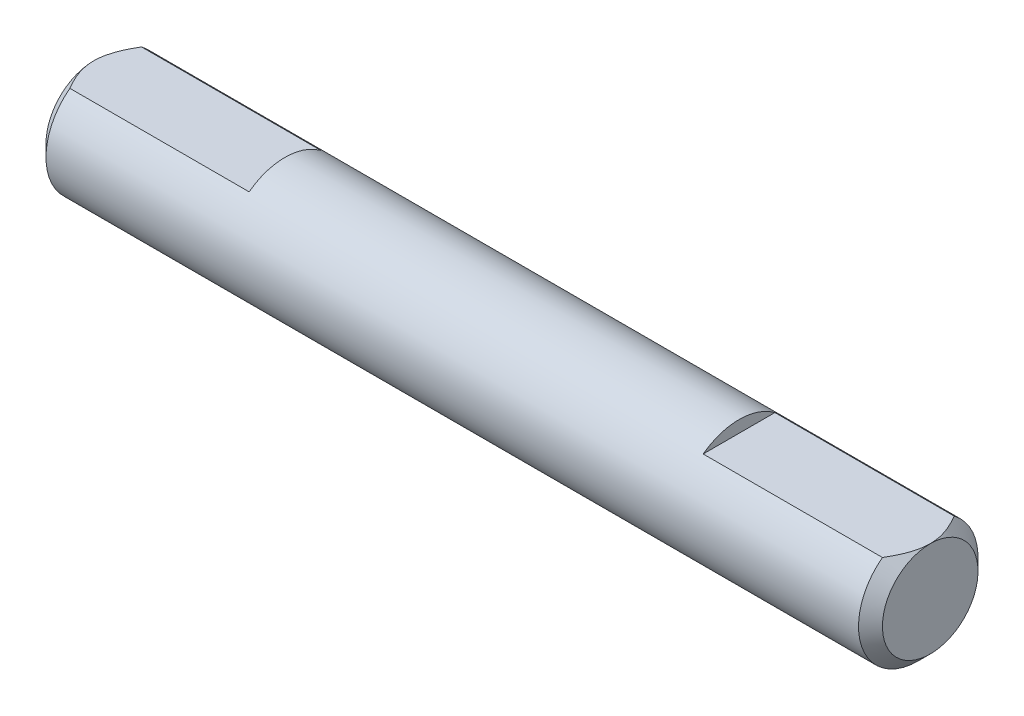
ISO-10303-21;
HEADER;
FILE_DESCRIPTION(('STEP AP214'),'2;1');
FILE_NAME('part.step','',(''),(''),'','','');
FILE_SCHEMA(('AUTOMOTIVE_DESIGN { 1 0 10303 214 1 1 1 1 }'));
ENDSEC;
DATA;
#1=APPLICATION_CONTEXT('core data for automotive mechanical design processes');
#2=APPLICATION_PROTOCOL_DEFINITION('international standard','automotive_design',2000,#1);
#3=PRODUCT_CONTEXT('',#1,'mechanical');
#4=PRODUCT('Part','Part','',(#3));
#5=PRODUCT_RELATED_PRODUCT_CATEGORY('part','',(#4));
#6=PRODUCT_DEFINITION_FORMATION('','',#4);
#7=PRODUCT_DEFINITION_CONTEXT('part definition',#1,'design');
#8=PRODUCT_DEFINITION('design','',#6,#7);
#9=PRODUCT_DEFINITION_SHAPE('','',#8);
#10=(LENGTH_UNIT() NAMED_UNIT(*) SI_UNIT(.MILLI.,.METRE.));
#11=(NAMED_UNIT(*) PLANE_ANGLE_UNIT() SI_UNIT($,.RADIAN.));
#12=(NAMED_UNIT(*) SI_UNIT($,.STERADIAN.) SOLID_ANGLE_UNIT());
#13=UNCERTAINTY_MEASURE_WITH_UNIT(LENGTH_MEASURE(1.E-05),#10,'distance_accuracy_value','');
#14=(GEOMETRIC_REPRESENTATION_CONTEXT(3) GLOBAL_UNCERTAINTY_ASSIGNED_CONTEXT((#13)) GLOBAL_UNIT_ASSIGNED_CONTEXT((#10,
#11,#12)) REPRESENTATION_CONTEXT('',''));
#15=CARTESIAN_POINT('',(0.,0.,0.));
#16=DIRECTION('',(0.,0.,1.));
#17=DIRECTION('',(1.,0.,0.));
#18=AXIS2_PLACEMENT_3D('',#15,#16,#17);
#19=CARTESIAN_POINT('',(17.5,0.,0.));
#20=DIRECTION('',(-1.,0.,0.));
#21=DIRECTION('',(0.,0.,1.));
#22=AXIS2_PLACEMENT_3D('',#19,#20,#21);
#23=CYLINDRICAL_SURFACE('',#22,2.5);
#24=DIRECTION('',(-1.,0.,0.));
#25=VECTOR('',#24,1.);
#26=CARTESIAN_POINT('',(17.5,2.,1.5));
#27=LINE('',#26,#25);
#28=CARTESIAN_POINT('',(-9.5,2.,1.5));
#29=VERTEX_POINT('',#28);
#30=CARTESIAN_POINT('',(-17.,2.,1.5));
#31=VERTEX_POINT('',#30);
#32=EDGE_CURVE('E80',#29,#31,#27,.T.);
#33=ORIENTED_EDGE('',*,*,#32,.T.);
#34=CARTESIAN_POINT('',(-17.,0.,0.));
#35=DIRECTION('',(1.,0.,0.));
#36=DIRECTION('',(0.,0.,-1.));
#37=AXIS2_PLACEMENT_3D('',#34,#35,#36);
#38=CIRCLE('',#37,2.5);
#39=CARTESIAN_POINT('',(-17.,2.,-1.5));
#40=VERTEX_POINT('',#39);
#41=EDGE_CURVE('E162',#31,#40,#38,.T.);
#42=ORIENTED_EDGE('',*,*,#41,.T.);
#43=DIRECTION('',(-1.,0.,0.));
#44=VECTOR('',#43,1.);
#45=CARTESIAN_POINT('',(17.5,2.,-1.5));
#46=LINE('',#45,#44);
#47=CARTESIAN_POINT('',(-9.5,2.,-1.5));
#48=VERTEX_POINT('',#47);
#49=EDGE_CURVE('E90',#40,#48,#46,.F.);
#50=ORIENTED_EDGE('',*,*,#49,.T.);
#51=CARTESIAN_POINT('',(-9.5,0.,0.));
#52=DIRECTION('',(-1.,0.,0.));
#53=DIRECTION('',(0.,0.,1.));
#54=AXIS2_PLACEMENT_3D('',#51,#52,#53);
#55=CIRCLE('',#54,2.5);
#56=EDGE_CURVE('E95',#29,#48,#55,.T.);
#57=ORIENTED_EDGE('',*,*,#56,.F.);
#58=EDGE_LOOP('',(#33,#42,#50,#57));
#59=FACE_BOUND('',#58,.T.);
#60=DIRECTION('',(-1.,0.,0.));
#61=VECTOR('',#60,1.);
#62=CARTESIAN_POINT('',(17.5,2.,-1.5));
#63=LINE('',#62,#61);
#64=CARTESIAN_POINT('',(17.,2.,-1.5));
#65=VERTEX_POINT('',#64);
#66=CARTESIAN_POINT('',(9.5,2.,-1.5));
#67=VERTEX_POINT('',#66);
#68=EDGE_CURVE('E104',#65,#67,#63,.T.);
#69=ORIENTED_EDGE('',*,*,#68,.F.);
#70=CARTESIAN_POINT('',(17.,0.,0.));
#71=DIRECTION('',(1.,0.,0.));
#72=DIRECTION('',(0.,0.,-1.));
#73=AXIS2_PLACEMENT_3D('',#70,#71,#72);
#74=CIRCLE('',#73,2.5);
#75=CARTESIAN_POINT('',(17.,2.,1.5));
#76=VERTEX_POINT('',#75);
#77=EDGE_CURVE('E149',#65,#76,#74,.F.);
#78=ORIENTED_EDGE('',*,*,#77,.T.);
#79=DIRECTION('',(-1.,0.,0.));
#80=VECTOR('',#79,1.);
#81=CARTESIAN_POINT('',(17.5,2.,1.5));
#82=LINE('',#81,#80);
#83=CARTESIAN_POINT('',(9.5,2.,1.5));
#84=VERTEX_POINT('',#83);
#85=EDGE_CURVE('E155',#84,#76,#82,.F.);
#86=ORIENTED_EDGE('',*,*,#85,.F.);
#87=CARTESIAN_POINT('',(9.5,0.,0.));
#88=DIRECTION('',(1.,0.,0.));
#89=DIRECTION('',(0.,0.,-1.));
#90=AXIS2_PLACEMENT_3D('',#87,#88,#89);
#91=CIRCLE('',#90,2.5);
#92=EDGE_CURVE('E99',#67,#84,#91,.T.);
#93=ORIENTED_EDGE('',*,*,#92,.F.);
#94=EDGE_LOOP('',(#69,#78,#86,#93));
#95=FACE_BOUND('',#94,.T.);
#96=ADVANCED_FACE('F34',(#59,#95),#23,.T.);
#97=CARTESIAN_POINT('',(17.5,0.,0.));
#98=DIRECTION('',(1.,0.,0.));
#99=DIRECTION('',(0.,0.,-1.));
#100=AXIS2_PLACEMENT_3D('',#97,#98,#99);
#101=PLANE('',#100);
#102=CARTESIAN_POINT('',(17.5,0.,0.));
#103=DIRECTION('',(1.,0.,0.));
#104=DIRECTION('',(0.,0.,-1.));
#105=AXIS2_PLACEMENT_3D('',#102,#103,#104);
#106=CIRCLE('',#105,2.00000000000001);
#107=CARTESIAN_POINT('',(17.5,2.,0.));
#108=VERTEX_POINT('',#107);
#109=EDGE_CURVE('E98',#108,#108,#106,.T.);
#110=ORIENTED_EDGE('',*,*,#109,.T.);
#111=EDGE_LOOP('',(#110));
#112=FACE_BOUND('',#111,.T.);
#113=ADVANCED_FACE('F136',(#112),#101,.T.);
#114=CARTESIAN_POINT('',(-17.5,0.,0.));
#115=DIRECTION('',(1.,0.,0.));
#116=DIRECTION('',(0.,0.,-1.));
#117=AXIS2_PLACEMENT_3D('',#114,#115,#116);
#118=PLANE('',#117);
#119=CARTESIAN_POINT('',(-17.5,0.,0.));
#120=DIRECTION('',(1.,0.,0.));
#121=DIRECTION('',(0.,0.,-1.));
#122=AXIS2_PLACEMENT_3D('',#119,#120,#121);
#123=CIRCLE('',#122,2.);
#124=CARTESIAN_POINT('',(-17.5,2.,0.));
#125=VERTEX_POINT('',#124);
#126=EDGE_CURVE('E11',#125,#125,#123,.F.);
#127=ORIENTED_EDGE('',*,*,#126,.T.);
#128=EDGE_LOOP('',(#127));
#129=FACE_BOUND('',#128,.T.);
#130=ADVANCED_FACE('F137',(#129),#118,.F.);
#131=CARTESIAN_POINT('',(9.5,0.,0.));
#132=DIRECTION('',(1.,0.,0.));
#133=DIRECTION('',(0.,0.,-1.));
#134=AXIS2_PLACEMENT_3D('',#131,#132,#133);
#135=PLANE('',#134);
#136=ORIENTED_EDGE('',*,*,#92,.T.);
#137=DIRECTION('',(0.,0.,-1.));
#138=VECTOR('',#137,1.);
#139=CARTESIAN_POINT('',(9.5,2.,3.70237345930251));
#140=LINE('',#139,#138);
#141=EDGE_CURVE('E89',#84,#67,#140,.T.);
#142=ORIENTED_EDGE('',*,*,#141,.T.);
#143=EDGE_LOOP('',(#136,#142));
#144=FACE_BOUND('',#143,.T.);
#145=ADVANCED_FACE('F139',(#144),#135,.T.);
#146=CARTESIAN_POINT('',(17.5,2.,3.70237345930251));
#147=DIRECTION('',(0.,1.,0.));
#148=DIRECTION('',(0.,0.,1.));
#149=AXIS2_PLACEMENT_3D('',#146,#147,#148);
#150=PLANE('',#149);
#151=CARTESIAN_POINT('',(17.,2.,1.5));
#152=CARTESIAN_POINT('',(17.0433736980276,2.,1.42763018659213));
#153=CARTESIAN_POINT('',(17.0853687019536,2.,1.35436226532258));
#154=CARTESIAN_POINT('',(17.1656443583189,2.,1.20549660628808));
#155=CARTESIAN_POINT('',(17.2039114197062,2.,1.12989157710704));
#156=CARTESIAN_POINT('',(17.274534191742,2.,0.978296734874826));
#157=CARTESIAN_POINT('',(17.3070165390548,2.,0.902366736266402));
#158=CARTESIAN_POINT('',(17.365809016699,2.,0.748220644904068));
#159=CARTESIAN_POINT('',(17.3921276624893,2.,0.670007876047698));
#160=CARTESIAN_POINT('',(17.4280861032667,2.,0.543060600019238));
#161=CARTESIAN_POINT('',(17.4401901027996,2.,0.495021163503637));
#162=CARTESIAN_POINT('',(17.4612794306282,2.,0.398260419217579));
#163=CARTESIAN_POINT('',(17.4702651517484,2.,0.349539198139852));
#164=CARTESIAN_POINT('',(17.4849271240241,2.,0.250852177401956));
#165=CARTESIAN_POINT('',(17.4905520018212,2.,0.200878654038628));
#166=CARTESIAN_POINT('',(17.4981023484678,2.,0.100607619276171));
#167=CARTESIAN_POINT('',(17.5000243314446,2.,0.0503098472705272));
#168=CARTESIAN_POINT('',(17.5,2.,0.));
#169=B_SPLINE_CURVE_WITH_KNOTS('',3,(#151,#152,#153,#154,#155,#156,#157,#158,#159,#160,#161,
#162,#163,#164,#165,#166,#167,#168),.UNSPECIFIED.,.F.,.F.,(4,2,2,2,2,2,2,2,4),(0.,
0.253195034695599,0.507281075974289,0.754837752612881,1.00205037282502,1.15058504578388,
1.29910100031797,1.44983263801686,1.60070610394699),.UNSPECIFIED.);
#170=EDGE_CURVE('E102',#76,#108,#169,.T.);
#171=ORIENTED_EDGE('',*,*,#170,.T.);
#172=CARTESIAN_POINT('',(17.5,2.00000000000001,0.));
#173=CARTESIAN_POINT('',(17.5000514930088,2.,-0.0614966481035619));
#174=CARTESIAN_POINT('',(17.497164788165,2.,-0.122961796118779));
#175=CARTESIAN_POINT('',(17.4859212389057,2.,-0.245274670057058));
#176=CARTESIAN_POINT('',(17.4775750221521,2.,-0.306123362775478));
#177=CARTESIAN_POINT('',(17.4559969816614,2.,-0.425885509906891));
#178=CARTESIAN_POINT('',(17.4428488248966,2.,-0.484814317272309));
#179=CARTESIAN_POINT('',(17.4122507618696,2.,-0.601555526074534));
#180=CARTESIAN_POINT('',(17.3947990813251,2.,-0.659367456410754));
#181=CARTESIAN_POINT('',(17.3525702057821,2.,-0.784576263433313));
#182=CARTESIAN_POINT('',(17.3270315815753,2.,-0.851714510760655));
#183=CARTESIAN_POINT('',(17.2717452055525,2.,-0.984250024576911));
#184=CARTESIAN_POINT('',(17.2419954048129,2.,-1.04964642506795));
#185=CARTESIAN_POINT('',(17.1784785026746,2.,-1.18016546542205));
#186=CARTESIAN_POINT('',(17.1446394298057,2.,-1.24525271545219));
#187=CARTESIAN_POINT('',(17.0742160914667,2.,-1.37378197006118));
#188=CARTESIAN_POINT('',(17.0376367483736,2.,-1.43722666174301));
#189=CARTESIAN_POINT('',(17.,2.,-1.5));
#190=B_SPLINE_CURVE_WITH_KNOTS('',3,(#172,#173,#174,#175,#176,#177,#178,#179,#180,#181,#182,
#183,#184,#185,#186,#187,#188,#189),.UNSPECIFIED.,.F.,.F.,(4,2,2,2,2,2,2,2,4),(0.,
0.184371949240825,0.368386057907036,0.549336051664293,0.730360773654886,0.945674044871391,
1.16109243790835,1.38109142427278,1.60070428639641),.UNSPECIFIED.);
#191=EDGE_CURVE('E115',#108,#65,#190,.T.);
#192=ORIENTED_EDGE('',*,*,#191,.T.);
#193=ORIENTED_EDGE('',*,*,#68,.T.);
#194=ORIENTED_EDGE('',*,*,#141,.F.);
#195=ORIENTED_EDGE('',*,*,#85,.T.);
#196=EDGE_LOOP('',(#171,#192,#193,#194,#195));
#197=FACE_BOUND('',#196,.T.);
#198=ADVANCED_FACE('F121',(#197),#150,.T.);
#199=CARTESIAN_POINT('',(-9.5,0.,0.));
#200=DIRECTION('',(-1.,0.,0.));
#201=DIRECTION('',(0.,0.,-1.));
#202=AXIS2_PLACEMENT_3D('',#199,#200,#201);
#203=PLANE('',#202);
#204=ORIENTED_EDGE('',*,*,#56,.T.);
#205=DIRECTION('',(0.,0.,-1.));
#206=VECTOR('',#205,1.);
#207=CARTESIAN_POINT('',(-9.5,2.,3.70237345930251));
#208=LINE('',#207,#206);
#209=EDGE_CURVE('E84',#29,#48,#208,.T.);
#210=ORIENTED_EDGE('',*,*,#209,.F.);
#211=EDGE_LOOP('',(#204,#210));
#212=FACE_BOUND('',#211,.T.);
#213=ADVANCED_FACE('F94',(#212),#203,.T.);
#214=CARTESIAN_POINT('',(-17.5,2.,3.70237345930251));
#215=DIRECTION('',(0.,-1.,0.));
#216=DIRECTION('',(0.,0.,-1.));
#217=AXIS2_PLACEMENT_3D('',#214,#215,#216);
#218=PLANE('',#217);
#219=ORIENTED_EDGE('',*,*,#49,.F.);
#220=CARTESIAN_POINT('',(-17.,2.,-1.5));
#221=CARTESIAN_POINT('',(-17.0433736980276,2.,-1.42763018659213));
#222=CARTESIAN_POINT('',(-17.0853687019536,2.,-1.35436226532257));
#223=CARTESIAN_POINT('',(-17.1656443583189,2.,-1.20549660628808));
#224=CARTESIAN_POINT('',(-17.2039114197061,2.,-1.12989157710704));
#225=CARTESIAN_POINT('',(-17.274534191742,2.,-0.978296734874824));
#226=CARTESIAN_POINT('',(-17.3070165390548,2.,-0.9023667362664));
#227=CARTESIAN_POINT('',(-17.3658090166989,2.,-0.748220644904065));
#228=CARTESIAN_POINT('',(-17.3921276624893,2.,-0.670007876047695));
#229=CARTESIAN_POINT('',(-17.4280861032667,2.,-0.543060600019235));
#230=CARTESIAN_POINT('',(-17.4401901027996,2.,-0.495021163503635));
#231=CARTESIAN_POINT('',(-17.4612794306282,2.,-0.398260419217576));
#232=CARTESIAN_POINT('',(-17.4702651517484,2.,-0.349539198139849));
#233=CARTESIAN_POINT('',(-17.484927124024,2.,-0.250852177401954));
#234=CARTESIAN_POINT('',(-17.4905520018212,2.,-0.200878654038626));
#235=CARTESIAN_POINT('',(-17.4981023484678,2.,-0.100607619276168));
#236=CARTESIAN_POINT('',(-17.5000243314446,2.,-0.050309847270524));
#237=CARTESIAN_POINT('',(-17.5,2.,0.));
#238=B_SPLINE_CURVE_WITH_KNOTS('',3,(#220,#221,#222,#223,#224,#225,#226,#227,#228,#229,#230,
#231,#232,#233,#234,#235,#236,#237),.UNSPECIFIED.,.F.,.F.,(4,2,2,2,2,2,2,2,4),(0.,
0.253195034695599,0.50728107597429,0.754837752612881,1.00205037282502,1.15058504578389,
1.29910100031797,1.44983263801686,1.60070610394699),.UNSPECIFIED.);
#239=EDGE_CURVE('E44',#40,#125,#238,.T.);
#240=ORIENTED_EDGE('',*,*,#239,.T.);
#241=CARTESIAN_POINT('',(-17.5,2.,0.));
#242=CARTESIAN_POINT('',(-17.5000514930088,2.,0.0614966481035621));
#243=CARTESIAN_POINT('',(-17.497164788165,2.,0.12296179611878));
#244=CARTESIAN_POINT('',(-17.4859212389057,2.,0.245274670057059));
#245=CARTESIAN_POINT('',(-17.4775750221521,2.,0.306123362775479));
#246=CARTESIAN_POINT('',(-17.4559969816614,2.,0.425885509906893));
#247=CARTESIAN_POINT('',(-17.4428488248966,2.,0.484814317272311));
#248=CARTESIAN_POINT('',(-17.4122507618696,2.,0.601555526074537));
#249=CARTESIAN_POINT('',(-17.3947990813251,2.,0.659367456410757));
#250=CARTESIAN_POINT('',(-17.3525702057821,2.,0.784576263433316));
#251=CARTESIAN_POINT('',(-17.3270315815753,2.,0.851714510760659));
#252=CARTESIAN_POINT('',(-17.2717452055525,2.,0.984250024576915));
#253=CARTESIAN_POINT('',(-17.2419954048129,2.,1.04964642506796));
#254=CARTESIAN_POINT('',(-17.1784785026746,2.,1.18016546542206));
#255=CARTESIAN_POINT('',(-17.1446394298057,2.,1.24525271545219));
#256=CARTESIAN_POINT('',(-17.0742160914667,2.,1.37378197006118));
#257=CARTESIAN_POINT('',(-17.0376367483736,2.,1.43722666174302));
#258=CARTESIAN_POINT('',(-17.,2.,1.5));
#259=B_SPLINE_CURVE_WITH_KNOTS('',3,(#241,#242,#243,#244,#245,#246,#247,#248,#249,#250,#251,
#252,#253,#254,#255,#256,#257,#258),.UNSPECIFIED.,.F.,.F.,(4,2,2,2,2,2,2,2,4),(0.,
0.184371949240826,0.368386057907038,0.549336051664294,0.730360773654891,0.945674044871395,
1.16109243790835,1.38109142427279,1.60070428639641),.UNSPECIFIED.);
#260=EDGE_CURVE('E86',#125,#31,#259,.T.);
#261=ORIENTED_EDGE('',*,*,#260,.T.);
#262=ORIENTED_EDGE('',*,*,#32,.F.);
#263=ORIENTED_EDGE('',*,*,#209,.T.);
#264=EDGE_LOOP('',(#219,#240,#261,#262,#263));
#265=FACE_BOUND('',#264,.T.);
#266=ADVANCED_FACE('F83',(#265),#218,.F.);
#267=CARTESIAN_POINT('',(17.5,0.,0.));
#268=DIRECTION('',(-1.,0.,0.));
#269=DIRECTION('',(0.,0.,1.));
#270=AXIS2_PLACEMENT_3D('',#267,#268,#269);
#271=CONICAL_SURFACE('',#270,2.00000000000001,0.785398163397446);
#272=ORIENTED_EDGE('',*,*,#170,.F.);
#273=ORIENTED_EDGE('',*,*,#77,.F.);
#274=ORIENTED_EDGE('',*,*,#191,.F.);
#275=ORIENTED_EDGE('',*,*,#109,.F.);
#276=EDGE_LOOP('',(#272,#273,#274,#275));
#277=FACE_BOUND('',#276,.T.);
#278=ADVANCED_FACE('F126',(#277),#271,.T.);
#279=CARTESIAN_POINT('',(-17.,0.,0.));
#280=DIRECTION('',(1.,0.,0.));
#281=DIRECTION('',(0.,0.,-1.));
#282=AXIS2_PLACEMENT_3D('',#279,#280,#281);
#283=CONICAL_SURFACE('',#282,2.5,0.78539816339745);
#284=ORIENTED_EDGE('',*,*,#260,.F.);
#285=ORIENTED_EDGE('',*,*,#126,.F.);
#286=ORIENTED_EDGE('',*,*,#239,.F.);
#287=ORIENTED_EDGE('',*,*,#41,.F.);
#288=EDGE_LOOP('',(#284,#285,#286,#287));
#289=FACE_BOUND('',#288,.T.);
#290=ADVANCED_FACE('F37',(#289),#283,.T.);
#291=CLOSED_SHELL('',(#96,#113,#130,#145,#198,#213,#266,#278,#290));
#292=MANIFOLD_SOLID_BREP('B2',#291);
#293=ADVANCED_BREP_SHAPE_REPRESENTATION('',(#18,#292),#14);
#294=SHAPE_DEFINITION_REPRESENTATION(#9,#293);
ENDSEC;
END-ISO-10303-21;
